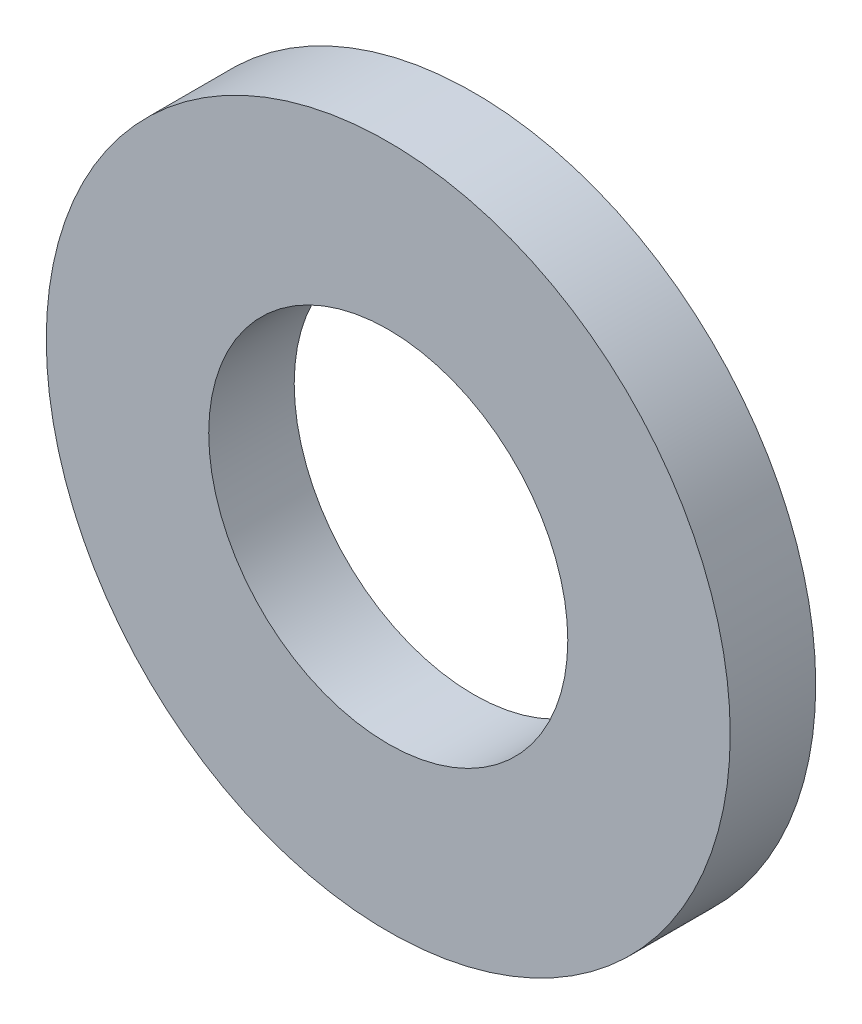
ISO-10303-21;
HEADER;
FILE_DESCRIPTION(('STEP AP214'),'2;1');
FILE_NAME('part.step','',(''),(''),'','','');
FILE_SCHEMA(('AUTOMOTIVE_DESIGN { 1 0 10303 214 1 1 1 1 }'));
ENDSEC;
DATA;
#1=APPLICATION_CONTEXT('core data for automotive mechanical design processes');
#2=APPLICATION_PROTOCOL_DEFINITION('international standard','automotive_design',2000,#1);
#3=PRODUCT_CONTEXT('',#1,'mechanical');
#4=PRODUCT('Part','Part','',(#3));
#5=PRODUCT_RELATED_PRODUCT_CATEGORY('part','',(#4));
#6=PRODUCT_DEFINITION_FORMATION('','',#4);
#7=PRODUCT_DEFINITION_CONTEXT('part definition',#1,'design');
#8=PRODUCT_DEFINITION('design','',#6,#7);
#9=PRODUCT_DEFINITION_SHAPE('','',#8);
#10=(LENGTH_UNIT() NAMED_UNIT(*) SI_UNIT(.MILLI.,.METRE.));
#11=(NAMED_UNIT(*) PLANE_ANGLE_UNIT() SI_UNIT($,.RADIAN.));
#12=(NAMED_UNIT(*) SI_UNIT($,.STERADIAN.) SOLID_ANGLE_UNIT());
#13=UNCERTAINTY_MEASURE_WITH_UNIT(LENGTH_MEASURE(1.E-05),#10,'distance_accuracy_value','');
#14=(GEOMETRIC_REPRESENTATION_CONTEXT(3) GLOBAL_UNCERTAINTY_ASSIGNED_CONTEXT((#13)) GLOBAL_UNIT_ASSIGNED_CONTEXT((#10,
#11,#12)) REPRESENTATION_CONTEXT('',''));
#15=CARTESIAN_POINT('',(0.,0.,0.));
#16=DIRECTION('',(0.,0.,1.));
#17=DIRECTION('',(1.,0.,0.));
#18=AXIS2_PLACEMENT_3D('',#15,#16,#17);
#19=CARTESIAN_POINT('',(0.,0.,1.));
#20=DIRECTION('',(0.,0.,1.));
#21=DIRECTION('',(1.,0.,0.));
#22=AXIS2_PLACEMENT_3D('',#19,#20,#21);
#23=PLANE('',#22);
#24=CARTESIAN_POINT('',(0.,0.,1.));
#25=DIRECTION('',(0.,0.,1.));
#26=DIRECTION('',(1.,0.,0.));
#27=AXIS2_PLACEMENT_3D('',#24,#25,#26);
#28=CIRCLE('',#27,4.);
#29=CARTESIAN_POINT('',(4.,0.,1.));
#30=VERTEX_POINT('',#29);
#31=EDGE_CURVE('E10',#30,#30,#28,.T.);
#32=ORIENTED_EDGE('',*,*,#31,.T.);
#33=EDGE_LOOP('',(#32));
#34=FACE_BOUND('',#33,.T.);
#35=CARTESIAN_POINT('',(0.,0.,1.));
#36=DIRECTION('',(0.,0.,1.));
#37=DIRECTION('',(1.,0.,0.));
#38=AXIS2_PLACEMENT_3D('',#35,#36,#37);
#39=CIRCLE('',#38,2.1);
#40=CARTESIAN_POINT('',(2.1,0.,1.));
#41=VERTEX_POINT('',#40);
#42=EDGE_CURVE('E42',#41,#41,#39,.T.);
#43=ORIENTED_EDGE('',*,*,#42,.F.);
#44=EDGE_LOOP('',(#43));
#45=FACE_BOUND('',#44,.T.);
#46=ADVANCED_FACE('F31',(#34,#45),#23,.T.);
#47=CARTESIAN_POINT('',(0.,0.,0.));
#48=DIRECTION('',(0.,0.,1.));
#49=DIRECTION('',(1.,0.,0.));
#50=AXIS2_PLACEMENT_3D('',#47,#48,#49);
#51=PLANE('',#50);
#52=CARTESIAN_POINT('',(0.,0.,0.));
#53=DIRECTION('',(0.,0.,1.));
#54=DIRECTION('',(1.,0.,0.));
#55=AXIS2_PLACEMENT_3D('',#52,#53,#54);
#56=CIRCLE('',#55,4.);
#57=CARTESIAN_POINT('',(4.,0.,0.));
#58=VERTEX_POINT('',#57);
#59=EDGE_CURVE('E35',#58,#58,#56,.T.);
#60=ORIENTED_EDGE('',*,*,#59,.F.);
#61=EDGE_LOOP('',(#60));
#62=FACE_BOUND('',#61,.T.);
#63=CARTESIAN_POINT('',(0.,0.,0.));
#64=DIRECTION('',(0.,0.,1.));
#65=DIRECTION('',(1.,0.,0.));
#66=AXIS2_PLACEMENT_3D('',#63,#64,#65);
#67=CIRCLE('',#66,2.1);
#68=CARTESIAN_POINT('',(2.1,0.,0.));
#69=VERTEX_POINT('',#68);
#70=EDGE_CURVE('E44',#69,#69,#67,.T.);
#71=ORIENTED_EDGE('',*,*,#70,.T.);
#72=EDGE_LOOP('',(#71));
#73=FACE_BOUND('',#72,.T.);
#74=ADVANCED_FACE('F54',(#62,#73),#51,.F.);
#75=CARTESIAN_POINT('',(0.,0.,1.));
#76=DIRECTION('',(0.,0.,-1.));
#77=DIRECTION('',(-1.,0.,0.));
#78=AXIS2_PLACEMENT_3D('',#75,#76,#77);
#79=CYLINDRICAL_SURFACE('',#78,4.);
#80=ORIENTED_EDGE('',*,*,#31,.F.);
#81=EDGE_LOOP('',(#80));
#82=FACE_BOUND('',#81,.T.);
#83=ORIENTED_EDGE('',*,*,#59,.T.);
#84=EDGE_LOOP('',(#83));
#85=FACE_BOUND('',#84,.T.);
#86=ADVANCED_FACE('F33',(#82,#85),#79,.T.);
#87=CARTESIAN_POINT('',(0.,0.,1.));
#88=DIRECTION('',(0.,0.,-1.));
#89=DIRECTION('',(-1.,0.,0.));
#90=AXIS2_PLACEMENT_3D('',#87,#88,#89);
#91=CYLINDRICAL_SURFACE('',#90,2.1);
#92=ORIENTED_EDGE('',*,*,#42,.T.);
#93=EDGE_LOOP('',(#92));
#94=FACE_BOUND('',#93,.T.);
#95=ORIENTED_EDGE('',*,*,#70,.F.);
#96=EDGE_LOOP('',(#95));
#97=FACE_BOUND('',#96,.T.);
#98=ADVANCED_FACE('F50',(#94,#97),#91,.F.);
#99=CLOSED_SHELL('',(#46,#74,#86,#98));
#100=MANIFOLD_SOLID_BREP('B2',#99);
#101=ADVANCED_BREP_SHAPE_REPRESENTATION('',(#18,#100),#14);
#102=SHAPE_DEFINITION_REPRESENTATION(#9,#101);
ENDSEC;
END-ISO-10303-21;
